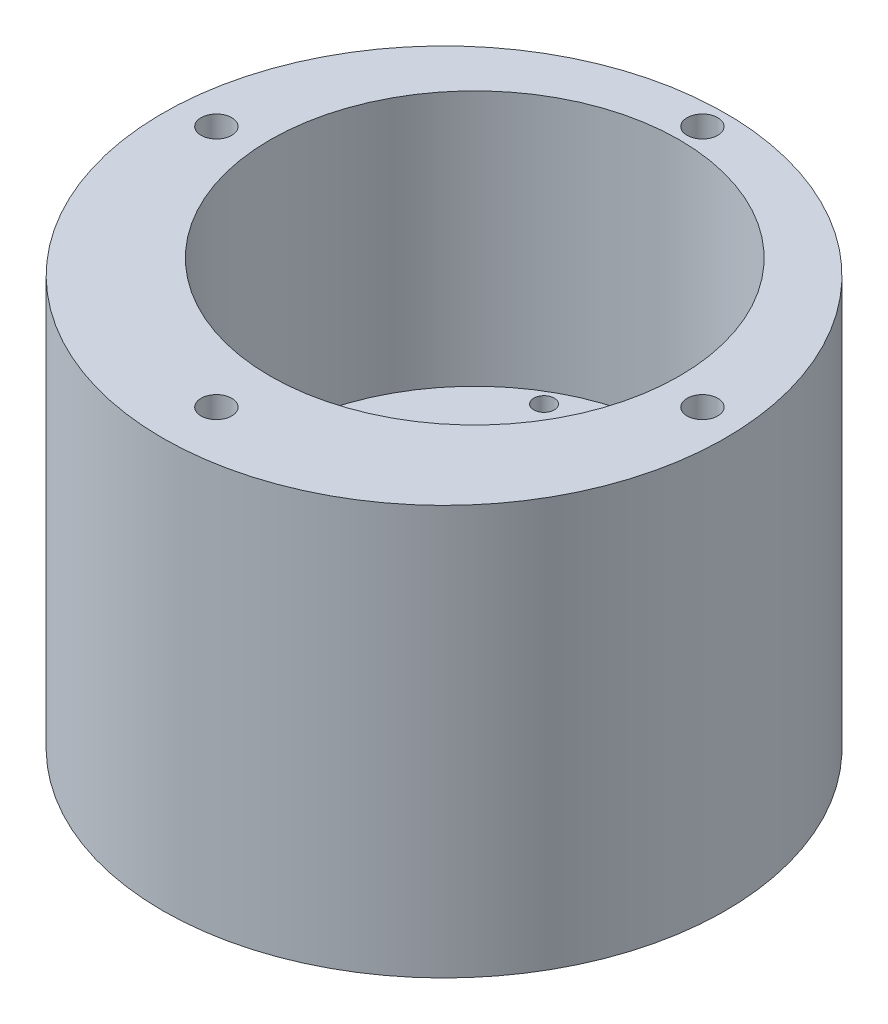
ISO-10303-21;
HEADER;
FILE_DESCRIPTION(('STEP AP214'),'2;1');
FILE_NAME('part.step','',(''),(''),'','','');
FILE_SCHEMA(('AUTOMOTIVE_DESIGN { 1 0 10303 214 1 1 1 1 }'));
ENDSEC;
DATA;
#1=APPLICATION_CONTEXT('core data for automotive mechanical design processes');
#2=APPLICATION_PROTOCOL_DEFINITION('international standard','automotive_design',2000,#1);
#3=PRODUCT_CONTEXT('',#1,'mechanical');
#4=PRODUCT('Part','Part','',(#3));
#5=PRODUCT_RELATED_PRODUCT_CATEGORY('part','',(#4));
#6=PRODUCT_DEFINITION_FORMATION('','',#4);
#7=PRODUCT_DEFINITION_CONTEXT('part definition',#1,'design');
#8=PRODUCT_DEFINITION('design','',#6,#7);
#9=PRODUCT_DEFINITION_SHAPE('','',#8);
#10=(LENGTH_UNIT() NAMED_UNIT(*) SI_UNIT(.MILLI.,.METRE.));
#11=(NAMED_UNIT(*) PLANE_ANGLE_UNIT() SI_UNIT($,.RADIAN.));
#12=(NAMED_UNIT(*) SI_UNIT($,.STERADIAN.) SOLID_ANGLE_UNIT());
#13=UNCERTAINTY_MEASURE_WITH_UNIT(LENGTH_MEASURE(1.E-05),#10,'distance_accuracy_value','');
#14=(GEOMETRIC_REPRESENTATION_CONTEXT(3) GLOBAL_UNCERTAINTY_ASSIGNED_CONTEXT((#13)) GLOBAL_UNIT_ASSIGNED_CONTEXT((#10,
#11,#12)) REPRESENTATION_CONTEXT('',''));
#15=CARTESIAN_POINT('',(0.,0.,0.));
#16=DIRECTION('',(0.,0.,1.));
#17=DIRECTION('',(1.,0.,0.));
#18=AXIS2_PLACEMENT_3D('',#15,#16,#17);
#19=CARTESIAN_POINT('',(0.,15.,0.));
#20=DIRECTION('',(0.,1.,0.));
#21=DIRECTION('',(0.,0.,1.));
#22=AXIS2_PLACEMENT_3D('',#19,#20,#21);
#23=PLANE('',#22);
#24=CARTESIAN_POINT('',(9.25,15.,-16.0214699700121));
#25=DIRECTION('',(0.,1.,0.));
#26=DIRECTION('',(0.,0.,1.));
#27=AXIS2_PLACEMENT_3D('',#24,#25,#26);
#28=CIRCLE('',#27,1.00000000000001);
#29=CARTESIAN_POINT('',(9.25,15.,-15.0214699700121));
#30=VERTEX_POINT('',#29);
#31=EDGE_CURVE('E11',#30,#30,#28,.T.);
#32=ORIENTED_EDGE('',*,*,#31,.F.);
#33=EDGE_LOOP('',(#32));
#34=FACE_BOUND('',#33,.T.);
#35=CARTESIAN_POINT('',(18.5,15.,0.));
#36=DIRECTION('',(0.,1.,0.));
#37=DIRECTION('',(0.,0.,1.));
#38=AXIS2_PLACEMENT_3D('',#35,#36,#37);
#39=CIRCLE('',#38,0.999999999999998);
#40=CARTESIAN_POINT('',(18.5,15.,1.00000000000001));
#41=VERTEX_POINT('',#40);
#42=EDGE_CURVE('E54',#41,#41,#39,.T.);
#43=ORIENTED_EDGE('',*,*,#42,.F.);
#44=EDGE_LOOP('',(#43));
#45=FACE_BOUND('',#44,.T.);
#46=CARTESIAN_POINT('',(9.25,15.,16.0214699700121));
#47=DIRECTION('',(0.,1.,0.));
#48=DIRECTION('',(0.,0.,1.));
#49=AXIS2_PLACEMENT_3D('',#46,#47,#48);
#50=CIRCLE('',#49,1.);
#51=CARTESIAN_POINT('',(9.25,15.,17.0214699700121));
#52=VERTEX_POINT('',#51);
#53=EDGE_CURVE('E60',#52,#52,#50,.T.);
#54=ORIENTED_EDGE('',*,*,#53,.F.);
#55=EDGE_LOOP('',(#54));
#56=FACE_BOUND('',#55,.T.);
#57=CARTESIAN_POINT('',(-9.25,15.,16.0214699700121));
#58=DIRECTION('',(0.,1.,0.));
#59=DIRECTION('',(0.,0.,1.));
#60=AXIS2_PLACEMENT_3D('',#57,#58,#59);
#61=CIRCLE('',#60,1.);
#62=CARTESIAN_POINT('',(-9.25,15.,17.0214699700121));
#63=VERTEX_POINT('',#62);
#64=EDGE_CURVE('E141',#63,#63,#61,.T.);
#65=ORIENTED_EDGE('',*,*,#64,.F.);
#66=EDGE_LOOP('',(#65));
#67=FACE_BOUND('',#66,.T.);
#68=CARTESIAN_POINT('',(-18.5,15.,0.));
#69=DIRECTION('',(0.,1.,0.));
#70=DIRECTION('',(0.,0.,1.));
#71=AXIS2_PLACEMENT_3D('',#68,#69,#70);
#72=CIRCLE('',#71,1.00000000000001);
#73=CARTESIAN_POINT('',(-18.5,15.,1.00000000000001));
#74=VERTEX_POINT('',#73);
#75=EDGE_CURVE('E137',#74,#74,#72,.T.);
#76=ORIENTED_EDGE('',*,*,#75,.F.);
#77=EDGE_LOOP('',(#76));
#78=FACE_BOUND('',#77,.T.);
#79=CARTESIAN_POINT('',(-9.25,15.,-16.0214699700121));
#80=DIRECTION('',(0.,1.,0.));
#81=DIRECTION('',(0.,0.,1.));
#82=AXIS2_PLACEMENT_3D('',#79,#80,#81);
#83=CIRCLE('',#82,0.999999999999966);
#84=CARTESIAN_POINT('',(-9.25,15.,-15.0214699700121));
#85=VERTEX_POINT('',#84);
#86=EDGE_CURVE('E93',#85,#85,#83,.T.);
#87=ORIENTED_EDGE('',*,*,#86,.F.);
#88=EDGE_LOOP('',(#87));
#89=FACE_BOUND('',#88,.T.);
#90=CARTESIAN_POINT('',(0.,15.,-10.));
#91=DIRECTION('',(0.,1.,0.));
#92=DIRECTION('',(0.,0.,1.));
#93=AXIS2_PLACEMENT_3D('',#90,#91,#92);
#94=CIRCLE('',#93,9.);
#95=CARTESIAN_POINT('',(0.,15.,-1.));
#96=VERTEX_POINT('',#95);
#97=EDGE_CURVE('E69',#96,#96,#94,.T.);
#98=ORIENTED_EDGE('',*,*,#97,.F.);
#99=EDGE_LOOP('',(#98));
#100=FACE_BOUND('',#99,.T.);
#101=CARTESIAN_POINT('',(0.,15.,0.));
#102=DIRECTION('',(0.,1.,0.));
#103=DIRECTION('',(0.,0.,1.));
#104=AXIS2_PLACEMENT_3D('',#101,#102,#103);
#105=CIRCLE('',#104,20.);
#106=CARTESIAN_POINT('',(0.,15.,20.));
#107=VERTEX_POINT('',#106);
#108=EDGE_CURVE('E109',#107,#107,#105,.T.);
#109=ORIENTED_EDGE('',*,*,#108,.T.);
#110=EDGE_LOOP('',(#109));
#111=FACE_BOUND('',#110,.T.);
#112=ADVANCED_FACE('F45',(#34,#45,#56,#67,#78,#89,#100,#111),#23,.T.);
#113=CARTESIAN_POINT('',(18.5,15.,0.));
#114=DIRECTION('',(0.,-1.,0.));
#115=DIRECTION('',(0.,0.,-1.));
#116=AXIS2_PLACEMENT_3D('',#113,#114,#115);
#117=CYLINDRICAL_SURFACE('',#116,0.999999999999998);
#118=ORIENTED_EDGE('',*,*,#42,.T.);
#119=EDGE_LOOP('',(#118));
#120=FACE_BOUND('',#119,.T.);
#121=CARTESIAN_POINT('',(18.5,0.,0.));
#122=DIRECTION('',(0.,1.,0.));
#123=DIRECTION('',(0.,0.,1.));
#124=AXIS2_PLACEMENT_3D('',#121,#122,#123);
#125=CIRCLE('',#124,0.999999999999998);
#126=CARTESIAN_POINT('',(18.5,0.,1.00000000000001));
#127=VERTEX_POINT('',#126);
#128=EDGE_CURVE('E85',#127,#127,#125,.T.);
#129=ORIENTED_EDGE('',*,*,#128,.F.);
#130=EDGE_LOOP('',(#129));
#131=FACE_BOUND('',#130,.T.);
#132=ADVANCED_FACE('F153',(#120,#131),#117,.F.);
#133=CARTESIAN_POINT('',(9.25,15.,16.0214699700121));
#134=DIRECTION('',(0.,-1.,0.));
#135=DIRECTION('',(0.,0.,-1.));
#136=AXIS2_PLACEMENT_3D('',#133,#134,#135);
#137=CYLINDRICAL_SURFACE('',#136,1.);
#138=ORIENTED_EDGE('',*,*,#53,.T.);
#139=EDGE_LOOP('',(#138));
#140=FACE_BOUND('',#139,.T.);
#141=CARTESIAN_POINT('',(9.25,0.,16.0214699700121));
#142=DIRECTION('',(0.,1.,0.));
#143=DIRECTION('',(0.,0.,1.));
#144=AXIS2_PLACEMENT_3D('',#141,#142,#143);
#145=CIRCLE('',#144,1.);
#146=CARTESIAN_POINT('',(9.25,0.,17.0214699700121));
#147=VERTEX_POINT('',#146);
#148=EDGE_CURVE('E81',#147,#147,#145,.T.);
#149=ORIENTED_EDGE('',*,*,#148,.F.);
#150=EDGE_LOOP('',(#149));
#151=FACE_BOUND('',#150,.T.);
#152=ADVANCED_FACE('F148',(#140,#151),#137,.F.);
#153=CARTESIAN_POINT('',(-9.25,15.,16.0214699700121));
#154=DIRECTION('',(0.,-1.,0.));
#155=DIRECTION('',(0.,0.,-1.));
#156=AXIS2_PLACEMENT_3D('',#153,#154,#155);
#157=CYLINDRICAL_SURFACE('',#156,1.);
#158=ORIENTED_EDGE('',*,*,#64,.T.);
#159=EDGE_LOOP('',(#158));
#160=FACE_BOUND('',#159,.T.);
#161=CARTESIAN_POINT('',(-9.25,0.,16.0214699700121));
#162=DIRECTION('',(0.,1.,0.));
#163=DIRECTION('',(0.,0.,1.));
#164=AXIS2_PLACEMENT_3D('',#161,#162,#163);
#165=CIRCLE('',#164,1.);
#166=CARTESIAN_POINT('',(-9.25,0.,17.0214699700121));
#167=VERTEX_POINT('',#166);
#168=EDGE_CURVE('E77',#167,#167,#165,.T.);
#169=ORIENTED_EDGE('',*,*,#168,.F.);
#170=EDGE_LOOP('',(#169));
#171=FACE_BOUND('',#170,.T.);
#172=ADVANCED_FACE('F204',(#160,#171),#157,.F.);
#173=CARTESIAN_POINT('',(-18.5,15.,0.));
#174=DIRECTION('',(0.,-1.,0.));
#175=DIRECTION('',(0.,0.,-1.));
#176=AXIS2_PLACEMENT_3D('',#173,#174,#175);
#177=CYLINDRICAL_SURFACE('',#176,1.00000000000001);
#178=ORIENTED_EDGE('',*,*,#75,.T.);
#179=EDGE_LOOP('',(#178));
#180=FACE_BOUND('',#179,.T.);
#181=CARTESIAN_POINT('',(-18.5,0.,0.));
#182=DIRECTION('',(0.,1.,0.));
#183=DIRECTION('',(0.,0.,1.));
#184=AXIS2_PLACEMENT_3D('',#181,#182,#183);
#185=CIRCLE('',#184,1.00000000000001);
#186=CARTESIAN_POINT('',(-18.5,0.,1.00000000000001));
#187=VERTEX_POINT('',#186);
#188=EDGE_CURVE('E73',#187,#187,#185,.T.);
#189=ORIENTED_EDGE('',*,*,#188,.F.);
#190=EDGE_LOOP('',(#189));
#191=FACE_BOUND('',#190,.T.);
#192=ADVANCED_FACE('F207',(#180,#191),#177,.F.);
#193=CARTESIAN_POINT('',(-9.25,15.,-16.0214699700121));
#194=DIRECTION('',(0.,-1.,0.));
#195=DIRECTION('',(0.,0.,-1.));
#196=AXIS2_PLACEMENT_3D('',#193,#194,#195);
#197=CYLINDRICAL_SURFACE('',#196,0.999999999999966);
#198=ORIENTED_EDGE('',*,*,#86,.T.);
#199=EDGE_LOOP('',(#198));
#200=FACE_BOUND('',#199,.T.);
#201=CARTESIAN_POINT('',(-9.25,0.,-16.0214699700121));
#202=DIRECTION('',(0.,1.,0.));
#203=DIRECTION('',(0.,0.,1.));
#204=AXIS2_PLACEMENT_3D('',#201,#202,#203);
#205=CIRCLE('',#204,0.999999999999966);
#206=CARTESIAN_POINT('',(-9.25,0.,-15.0214699700121));
#207=VERTEX_POINT('',#206);
#208=EDGE_CURVE('E68',#207,#207,#205,.T.);
#209=ORIENTED_EDGE('',*,*,#208,.F.);
#210=EDGE_LOOP('',(#209));
#211=FACE_BOUND('',#210,.T.);
#212=ADVANCED_FACE('F196',(#200,#211),#197,.F.);
#213=CARTESIAN_POINT('',(0.,15.,3.));
#214=DIRECTION('',(0.,-1.,0.));
#215=DIRECTION('',(0.,0.,-1.));
#216=AXIS2_PLACEMENT_3D('',#213,#214,#215);
#217=CYLINDRICAL_SURFACE('',#216,27.5);
#218=CARTESIAN_POINT('',(0.,0.,3.));
#219=DIRECTION('',(0.,1.,0.));
#220=DIRECTION('',(0.,0.,1.));
#221=AXIS2_PLACEMENT_3D('',#218,#219,#220);
#222=CIRCLE('',#221,27.5);
#223=CARTESIAN_POINT('',(0.,0.,30.5));
#224=VERTEX_POINT('',#223);
#225=EDGE_CURVE('E64',#224,#224,#222,.T.);
#226=ORIENTED_EDGE('',*,*,#225,.T.);
#227=EDGE_LOOP('',(#226));
#228=FACE_BOUND('',#227,.T.);
#229=CARTESIAN_POINT('',(0.,40.,3.));
#230=DIRECTION('',(0.,1.,0.));
#231=DIRECTION('',(0.,0.,1.));
#232=AXIS2_PLACEMENT_3D('',#229,#230,#231);
#233=CIRCLE('',#232,27.5);
#234=CARTESIAN_POINT('',(0.,40.,30.5));
#235=VERTEX_POINT('',#234);
#236=EDGE_CURVE('E120',#235,#235,#233,.T.);
#237=ORIENTED_EDGE('',*,*,#236,.F.);
#238=EDGE_LOOP('',(#237));
#239=FACE_BOUND('',#238,.T.);
#240=ADVANCED_FACE('F47',(#228,#239),#217,.T.);
#241=CARTESIAN_POINT('',(9.25,15.,-16.0214699700121));
#242=DIRECTION('',(0.,-1.,0.));
#243=DIRECTION('',(0.,0.,-1.));
#244=AXIS2_PLACEMENT_3D('',#241,#242,#243);
#245=CYLINDRICAL_SURFACE('',#244,1.00000000000001);
#246=ORIENTED_EDGE('',*,*,#31,.T.);
#247=EDGE_LOOP('',(#246));
#248=FACE_BOUND('',#247,.T.);
#249=CARTESIAN_POINT('',(9.25,0.,-16.0214699700121));
#250=DIRECTION('',(0.,1.,0.));
#251=DIRECTION('',(0.,0.,1.));
#252=AXIS2_PLACEMENT_3D('',#249,#250,#251);
#253=CIRCLE('',#252,1.00000000000001);
#254=CARTESIAN_POINT('',(9.25,0.,-15.0214699700121));
#255=VERTEX_POINT('',#254);
#256=EDGE_CURVE('E89',#255,#255,#253,.T.);
#257=ORIENTED_EDGE('',*,*,#256,.F.);
#258=EDGE_LOOP('',(#257));
#259=FACE_BOUND('',#258,.T.);
#260=ADVANCED_FACE('F174',(#248,#259),#245,.F.);
#261=CARTESIAN_POINT('',(0.,0.,0.));
#262=DIRECTION('',(0.,1.,0.));
#263=DIRECTION('',(0.,0.,1.));
#264=AXIS2_PLACEMENT_3D('',#261,#262,#263);
#265=PLANE('',#264);
#266=CARTESIAN_POINT('',(0.,0.,-22.25));
#267=DIRECTION('',(0.,1.,0.));
#268=DIRECTION('',(0.,0.,1.));
#269=AXIS2_PLACEMENT_3D('',#266,#267,#268);
#270=CIRCLE('',#269,1.5);
#271=CARTESIAN_POINT('',(0.,0.,-20.75));
#272=VERTEX_POINT('',#271);
#273=EDGE_CURVE('E99',#272,#272,#270,.T.);
#274=ORIENTED_EDGE('',*,*,#273,.T.);
#275=EDGE_LOOP('',(#274));
#276=FACE_BOUND('',#275,.T.);
#277=CARTESIAN_POINT('',(23.75,0.,1.5));
#278=DIRECTION('',(0.,1.,0.));
#279=DIRECTION('',(0.,0.,1.));
#280=AXIS2_PLACEMENT_3D('',#277,#278,#279);
#281=CIRCLE('',#280,1.5);
#282=CARTESIAN_POINT('',(23.75,0.,3.));
#283=VERTEX_POINT('',#282);
#284=EDGE_CURVE('E300',#283,#283,#281,.T.);
#285=ORIENTED_EDGE('',*,*,#284,.T.);
#286=EDGE_LOOP('',(#285));
#287=FACE_BOUND('',#286,.T.);
#288=CARTESIAN_POINT('',(0.,0.,25.25));
#289=DIRECTION('',(0.,1.,0.));
#290=DIRECTION('',(0.,0.,1.));
#291=AXIS2_PLACEMENT_3D('',#288,#289,#290);
#292=CIRCLE('',#291,1.5);
#293=CARTESIAN_POINT('',(0.,0.,26.75));
#294=VERTEX_POINT('',#293);
#295=EDGE_CURVE('E304',#294,#294,#292,.T.);
#296=ORIENTED_EDGE('',*,*,#295,.T.);
#297=EDGE_LOOP('',(#296));
#298=FACE_BOUND('',#297,.T.);
#299=CARTESIAN_POINT('',(-23.75,0.,1.5));
#300=DIRECTION('',(0.,1.,0.));
#301=DIRECTION('',(0.,0.,1.));
#302=AXIS2_PLACEMENT_3D('',#299,#300,#301);
#303=CIRCLE('',#302,1.5);
#304=CARTESIAN_POINT('',(-23.75,0.,3.));
#305=VERTEX_POINT('',#304);
#306=EDGE_CURVE('E309',#305,#305,#303,.T.);
#307=ORIENTED_EDGE('',*,*,#306,.T.);
#308=EDGE_LOOP('',(#307));
#309=FACE_BOUND('',#308,.T.);
#310=CARTESIAN_POINT('',(0.,0.,-10.));
#311=DIRECTION('',(0.,1.,0.));
#312=DIRECTION('',(0.,0.,1.));
#313=AXIS2_PLACEMENT_3D('',#310,#311,#312);
#314=CIRCLE('',#313,9.);
#315=CARTESIAN_POINT('',(0.,0.,-1.));
#316=VERTEX_POINT('',#315);
#317=EDGE_CURVE('E127',#316,#316,#314,.T.);
#318=ORIENTED_EDGE('',*,*,#317,.T.);
#319=EDGE_LOOP('',(#318));
#320=FACE_BOUND('',#319,.T.);
#321=ORIENTED_EDGE('',*,*,#225,.F.);
#322=EDGE_LOOP('',(#321));
#323=FACE_BOUND('',#322,.T.);
#324=ORIENTED_EDGE('',*,*,#208,.T.);
#325=EDGE_LOOP('',(#324));
#326=FACE_BOUND('',#325,.T.);
#327=ORIENTED_EDGE('',*,*,#188,.T.);
#328=EDGE_LOOP('',(#327));
#329=FACE_BOUND('',#328,.T.);
#330=ORIENTED_EDGE('',*,*,#168,.T.);
#331=EDGE_LOOP('',(#330));
#332=FACE_BOUND('',#331,.T.);
#333=ORIENTED_EDGE('',*,*,#148,.T.);
#334=EDGE_LOOP('',(#333));
#335=FACE_BOUND('',#334,.T.);
#336=ORIENTED_EDGE('',*,*,#128,.T.);
#337=EDGE_LOOP('',(#336));
#338=FACE_BOUND('',#337,.T.);
#339=ORIENTED_EDGE('',*,*,#256,.T.);
#340=EDGE_LOOP('',(#339));
#341=FACE_BOUND('',#340,.T.);
#342=ADVANCED_FACE('F168',(#276,#287,#298,#309,#320,#323,#326,#329,#332,#335,#338,#341),#265,.F.);
#343=CARTESIAN_POINT('',(0.,0.,-10.));
#344=DIRECTION('',(0.,1.,0.));
#345=DIRECTION('',(0.,0.,1.));
#346=AXIS2_PLACEMENT_3D('',#343,#344,#345);
#347=CYLINDRICAL_SURFACE('',#346,9.);
#348=ORIENTED_EDGE('',*,*,#97,.T.);
#349=EDGE_LOOP('',(#348));
#350=FACE_BOUND('',#349,.T.);
#351=ORIENTED_EDGE('',*,*,#317,.F.);
#352=EDGE_LOOP('',(#351));
#353=FACE_BOUND('',#352,.T.);
#354=ADVANCED_FACE('F164',(#350,#353),#347,.F.);
#355=CARTESIAN_POINT('',(0.,40.,3.));
#356=DIRECTION('',(0.,1.,0.));
#357=DIRECTION('',(0.,0.,1.));
#358=AXIS2_PLACEMENT_3D('',#355,#356,#357);
#359=PLANE('',#358);
#360=CARTESIAN_POINT('',(0.,40.,-22.25));
#361=DIRECTION('',(0.,1.,0.));
#362=DIRECTION('',(0.,0.,1.));
#363=AXIS2_PLACEMENT_3D('',#360,#361,#362);
#364=CIRCLE('',#363,1.5);
#365=CARTESIAN_POINT('',(0.,40.,-20.75));
#366=VERTEX_POINT('',#365);
#367=EDGE_CURVE('E49',#366,#366,#364,.T.);
#368=ORIENTED_EDGE('',*,*,#367,.F.);
#369=EDGE_LOOP('',(#368));
#370=FACE_BOUND('',#369,.T.);
#371=CARTESIAN_POINT('',(23.75,40.,1.5));
#372=DIRECTION('',(0.,1.,0.));
#373=DIRECTION('',(0.,0.,1.));
#374=AXIS2_PLACEMENT_3D('',#371,#372,#373);
#375=CIRCLE('',#374,1.5);
#376=CARTESIAN_POINT('',(23.75,40.,3.));
#377=VERTEX_POINT('',#376);
#378=EDGE_CURVE('E102',#377,#377,#375,.T.);
#379=ORIENTED_EDGE('',*,*,#378,.F.);
#380=EDGE_LOOP('',(#379));
#381=FACE_BOUND('',#380,.T.);
#382=CARTESIAN_POINT('',(0.,40.,25.25));
#383=DIRECTION('',(0.,1.,0.));
#384=DIRECTION('',(0.,0.,1.));
#385=AXIS2_PLACEMENT_3D('',#382,#383,#384);
#386=CIRCLE('',#385,1.5);
#387=CARTESIAN_POINT('',(0.,40.,26.75));
#388=VERTEX_POINT('',#387);
#389=EDGE_CURVE('E98',#388,#388,#386,.T.);
#390=ORIENTED_EDGE('',*,*,#389,.F.);
#391=EDGE_LOOP('',(#390));
#392=FACE_BOUND('',#391,.T.);
#393=CARTESIAN_POINT('',(-23.75,40.,1.5));
#394=DIRECTION('',(0.,1.,0.));
#395=DIRECTION('',(0.,0.,1.));
#396=AXIS2_PLACEMENT_3D('',#393,#394,#395);
#397=CIRCLE('',#396,1.5);
#398=CARTESIAN_POINT('',(-23.75,40.,3.));
#399=VERTEX_POINT('',#398);
#400=EDGE_CURVE('E94',#399,#399,#397,.T.);
#401=ORIENTED_EDGE('',*,*,#400,.F.);
#402=EDGE_LOOP('',(#401));
#403=FACE_BOUND('',#402,.T.);
#404=ORIENTED_EDGE('',*,*,#236,.T.);
#405=EDGE_LOOP('',(#404));
#406=FACE_BOUND('',#405,.T.);
#407=CARTESIAN_POINT('',(0.,40.,0.));
#408=DIRECTION('',(0.,1.,0.));
#409=DIRECTION('',(0.,0.,1.));
#410=AXIS2_PLACEMENT_3D('',#407,#408,#409);
#411=CIRCLE('',#410,20.);
#412=CARTESIAN_POINT('',(0.,40.,20.));
#413=VERTEX_POINT('',#412);
#414=EDGE_CURVE('E114',#413,#413,#411,.T.);
#415=ORIENTED_EDGE('',*,*,#414,.F.);
#416=EDGE_LOOP('',(#415));
#417=FACE_BOUND('',#416,.T.);
#418=ADVANCED_FACE('F167',(#370,#381,#392,#403,#406,#417),#359,.T.);
#419=CARTESIAN_POINT('',(0.,40.,0.));
#420=DIRECTION('',(0.,-1.,0.));
#421=DIRECTION('',(0.,0.,-1.));
#422=AXIS2_PLACEMENT_3D('',#419,#420,#421);
#423=CYLINDRICAL_SURFACE('',#422,20.);
#424=ORIENTED_EDGE('',*,*,#414,.T.);
#425=EDGE_LOOP('',(#424));
#426=FACE_BOUND('',#425,.T.);
#427=ORIENTED_EDGE('',*,*,#108,.F.);
#428=EDGE_LOOP('',(#427));
#429=FACE_BOUND('',#428,.T.);
#430=ADVANCED_FACE('F233',(#426,#429),#423,.F.);
#431=CARTESIAN_POINT('',(-23.75,0.,1.5));
#432=DIRECTION('',(0.,1.,0.));
#433=DIRECTION('',(0.,0.,1.));
#434=AXIS2_PLACEMENT_3D('',#431,#432,#433);
#435=CYLINDRICAL_SURFACE('',#434,1.5);
#436=ORIENTED_EDGE('',*,*,#400,.T.);
#437=EDGE_LOOP('',(#436));
#438=FACE_BOUND('',#437,.T.);
#439=ORIENTED_EDGE('',*,*,#306,.F.);
#440=EDGE_LOOP('',(#439));
#441=FACE_BOUND('',#440,.T.);
#442=ADVANCED_FACE('F238',(#438,#441),#435,.F.);
#443=CARTESIAN_POINT('',(0.,0.,25.25));
#444=DIRECTION('',(0.,1.,0.));
#445=DIRECTION('',(0.,0.,1.));
#446=AXIS2_PLACEMENT_3D('',#443,#444,#445);
#447=CYLINDRICAL_SURFACE('',#446,1.5);
#448=ORIENTED_EDGE('',*,*,#389,.T.);
#449=EDGE_LOOP('',(#448));
#450=FACE_BOUND('',#449,.T.);
#451=ORIENTED_EDGE('',*,*,#295,.F.);
#452=EDGE_LOOP('',(#451));
#453=FACE_BOUND('',#452,.T.);
#454=ADVANCED_FACE('F264',(#450,#453),#447,.F.);
#455=CARTESIAN_POINT('',(23.75,0.,1.5));
#456=DIRECTION('',(0.,1.,0.));
#457=DIRECTION('',(0.,0.,1.));
#458=AXIS2_PLACEMENT_3D('',#455,#456,#457);
#459=CYLINDRICAL_SURFACE('',#458,1.5);
#460=ORIENTED_EDGE('',*,*,#378,.T.);
#461=EDGE_LOOP('',(#460));
#462=FACE_BOUND('',#461,.T.);
#463=ORIENTED_EDGE('',*,*,#284,.F.);
#464=EDGE_LOOP('',(#463));
#465=FACE_BOUND('',#464,.T.);
#466=ADVANCED_FACE('F274',(#462,#465),#459,.F.);
#467=CARTESIAN_POINT('',(0.,0.,-22.25));
#468=DIRECTION('',(0.,1.,0.));
#469=DIRECTION('',(0.,0.,1.));
#470=AXIS2_PLACEMENT_3D('',#467,#468,#469);
#471=CYLINDRICAL_SURFACE('',#470,1.5);
#472=ORIENTED_EDGE('',*,*,#367,.T.);
#473=EDGE_LOOP('',(#472));
#474=FACE_BOUND('',#473,.T.);
#475=ORIENTED_EDGE('',*,*,#273,.F.);
#476=EDGE_LOOP('',(#475));
#477=FACE_BOUND('',#476,.T.);
#478=ADVANCED_FACE('F284',(#474,#477),#471,.F.);
#479=CLOSED_SHELL('',(#112,#132,#152,#172,#192,#212,#240,#260,#342,#354,#418,#430,#442,#454,
#466,#478));
#480=MANIFOLD_SOLID_BREP('B2',#479);
#481=ADVANCED_BREP_SHAPE_REPRESENTATION('',(#18,#480),#14);
#482=SHAPE_DEFINITION_REPRESENTATION(#9,#481);
ENDSEC;
END-ISO-10303-21;
